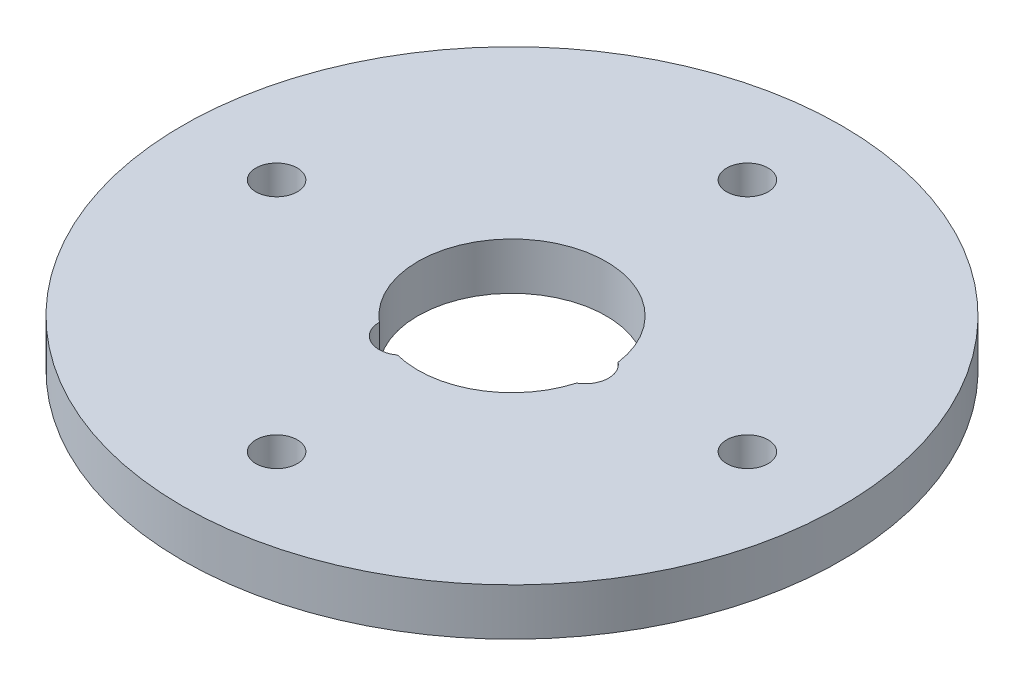
ISO-10303-21;
HEADER;
FILE_DESCRIPTION(('STEP AP214'),'2;1');
FILE_NAME('part.step','',(''),(''),'','','');
FILE_SCHEMA(('AUTOMOTIVE_DESIGN { 1 0 10303 214 1 1 1 1 }'));
ENDSEC;
DATA;
#1=APPLICATION_CONTEXT('core data for automotive mechanical design processes');
#2=APPLICATION_PROTOCOL_DEFINITION('international standard','automotive_design',2000,#1);
#3=PRODUCT_CONTEXT('',#1,'mechanical');
#4=PRODUCT('Part','Part','',(#3));
#5=PRODUCT_RELATED_PRODUCT_CATEGORY('part','',(#4));
#6=PRODUCT_DEFINITION_FORMATION('','',#4);
#7=PRODUCT_DEFINITION_CONTEXT('part definition',#1,'design');
#8=PRODUCT_DEFINITION('design','',#6,#7);
#9=PRODUCT_DEFINITION_SHAPE('','',#8);
#10=(LENGTH_UNIT() NAMED_UNIT(*) SI_UNIT(.MILLI.,.METRE.));
#11=(NAMED_UNIT(*) PLANE_ANGLE_UNIT() SI_UNIT($,.RADIAN.));
#12=(NAMED_UNIT(*) SI_UNIT($,.STERADIAN.) SOLID_ANGLE_UNIT());
#13=UNCERTAINTY_MEASURE_WITH_UNIT(LENGTH_MEASURE(1.E-05),#10,'distance_accuracy_value','');
#14=(GEOMETRIC_REPRESENTATION_CONTEXT(3) GLOBAL_UNCERTAINTY_ASSIGNED_CONTEXT((#13)) GLOBAL_UNIT_ASSIGNED_CONTEXT((#10,
#11,#12)) REPRESENTATION_CONTEXT('',''));
#15=CARTESIAN_POINT('',(0.,0.,0.));
#16=DIRECTION('',(0.,0.,1.));
#17=DIRECTION('',(1.,0.,0.));
#18=AXIS2_PLACEMENT_3D('',#15,#16,#17);
#19=CARTESIAN_POINT('',(-0.00401304574881721,3.75,-0.0154207823324574));
#20=DIRECTION('',(0.,-1.,0.));
#21=DIRECTION('',(0.,0.,-1.));
#22=AXIS2_PLACEMENT_3D('',#19,#20,#21);
#23=CYLINDRICAL_SURFACE('',#22,5.);
#24=DIRECTION('',(0.,-1.,0.));
#25=VECTOR('',#24,1.);
#26=CARTESIAN_POINT('',(4.80169126875611,2.5,1.36487123081139));
#27=LINE('',#26,#25);
#28=CARTESIAN_POINT('',(4.80169126875611,1.25,1.36487123081139));
#29=VERTEX_POINT('',#28);
#30=CARTESIAN_POINT('',(4.80169126875611,3.75,1.36487123081139));
#31=VERTEX_POINT('',#30);
#32=EDGE_CURVE('E13',#29,#31,#27,.F.);
#33=ORIENTED_EDGE('',*,*,#32,.F.);
#34=CARTESIAN_POINT('',(-0.00401304574881721,1.25,-0.0154207823324574));
#35=DIRECTION('',(0.,1.,0.));
#36=DIRECTION('',(0.,0.,1.));
#37=AXIS2_PLACEMENT_3D('',#34,#35,#36);
#38=CIRCLE('',#37,5.);
#39=CARTESIAN_POINT('',(-1.24269956867758,1.25,4.82871543560306));
#40=VERTEX_POINT('',#39);
#41=EDGE_CURVE('E104',#40,#29,#38,.T.);
#42=ORIENTED_EDGE('',*,*,#41,.F.);
#43=DIRECTION('',(0.,-1.,0.));
#44=VECTOR('',#43,1.);
#45=CARTESIAN_POINT('',(-1.24269956867758,2.5,4.82871543560306));
#46=LINE('',#45,#44);
#47=CARTESIAN_POINT('',(-1.24269956867758,3.75,4.82871543560306));
#48=VERTEX_POINT('',#47);
#49=EDGE_CURVE('E86',#48,#40,#46,.T.);
#50=ORIENTED_EDGE('',*,*,#49,.F.);
#51=CARTESIAN_POINT('',(-0.00401304574881721,3.75,-0.0154207823324574));
#52=DIRECTION('',(0.,1.,0.));
#53=DIRECTION('',(0.,0.,1.));
#54=AXIS2_PLACEMENT_3D('',#51,#52,#53);
#55=CIRCLE('',#54,5.);
#56=EDGE_CURVE('E111',#48,#31,#55,.T.);
#57=ORIENTED_EDGE('',*,*,#56,.T.);
#58=EDGE_LOOP('',(#33,#42,#50,#57));
#59=FACE_BOUND('',#58,.T.);
#60=ADVANCED_FACE('F49',(#59),#23,.F.);
#61=CARTESIAN_POINT('',(-0.00401304574881721,3.75,-0.0154207823324574));
#62=DIRECTION('',(0.,1.,0.));
#63=DIRECTION('',(0.,0.,1.));
#64=AXIS2_PLACEMENT_3D('',#61,#62,#63);
#65=PLANE('',#64);
#66=CARTESIAN_POINT('',(4.1754713074596,3.75,0.283044738219441));
#67=DIRECTION('',(0.,-1.,0.));
#68=DIRECTION('',(0.,0.,-1.));
#69=AXIS2_PLACEMENT_3D('',#66,#67,#68);
#70=CIRCLE('',#69,1.25);
#71=CARTESIAN_POINT('',(4.94906355657299,3.75,-0.698818303203185));
#72=VERTEX_POINT('',#71);
#73=EDGE_CURVE('E71',#72,#31,#70,.T.);
#74=ORIENTED_EDGE('',*,*,#73,.T.);
#75=ORIENTED_EDGE('',*,*,#56,.F.);
#76=CARTESIAN_POINT('',(-1.97872015545924,3.75,3.81838197786073));
#77=DIRECTION('',(0.,-1.,0.));
#78=DIRECTION('',(0.,0.,-1.));
#79=AXIS2_PLACEMENT_3D('',#76,#77,#78);
#80=CIRCLE('',#79,1.25);
#81=CARTESIAN_POINT('',(-3.22865675847568,3.75,3.805792758674));
#82=VERTEX_POINT('',#81);
#83=EDGE_CURVE('E64',#48,#82,#80,.T.);
#84=ORIENTED_EDGE('',*,*,#83,.T.);
#85=EDGE_CURVE('E125',#72,#82,#55,.T.);
#86=ORIENTED_EDGE('',*,*,#85,.F.);
#87=EDGE_LOOP('',(#74,#75,#84,#86));
#88=FACE_BOUND('',#87,.T.);
#89=CARTESIAN_POINT('',(-0.00401304574810973,3.75,12.4845792176675));
#90=DIRECTION('',(0.,1.,0.));
#91=DIRECTION('',(0.,0.,1.));
#92=AXIS2_PLACEMENT_3D('',#89,#90,#91);
#93=CIRCLE('',#92,1.10000000000076);
#94=CARTESIAN_POINT('',(-0.00401304574810973,3.75,13.5845792176683));
#95=VERTEX_POINT('',#94);
#96=EDGE_CURVE('E150',#95,#95,#93,.T.);
#97=ORIENTED_EDGE('',*,*,#96,.F.);
#98=EDGE_LOOP('',(#97));
#99=FACE_BOUND('',#98,.T.);
#100=CARTESIAN_POINT('',(-0.00401304574881721,3.75,-0.0154207823324574));
#101=DIRECTION('',(0.,1.,0.));
#102=DIRECTION('',(0.,0.,1.));
#103=AXIS2_PLACEMENT_3D('',#100,#101,#102);
#104=CIRCLE('',#103,17.5);
#105=CARTESIAN_POINT('',(-0.00401304574881721,3.75,17.4845792176675));
#106=VERTEX_POINT('',#105);
#107=EDGE_CURVE('E96',#106,#106,#104,.T.);
#108=ORIENTED_EDGE('',*,*,#107,.T.);
#109=EDGE_LOOP('',(#108));
#110=FACE_BOUND('',#109,.T.);
#111=CARTESIAN_POINT('',(-0.00401304574881721,3.75,-12.5154207823325));
#112=DIRECTION('',(0.,1.,0.));
#113=DIRECTION('',(0.,0.,1.));
#114=AXIS2_PLACEMENT_3D('',#111,#112,#113);
#115=CIRCLE('',#114,1.1);
#116=CARTESIAN_POINT('',(-0.00401304574881721,3.75,-11.4154207823325));
#117=VERTEX_POINT('',#116);
#118=EDGE_CURVE('E118',#117,#117,#115,.T.);
#119=ORIENTED_EDGE('',*,*,#118,.F.);
#120=EDGE_LOOP('',(#119));
#121=FACE_BOUND('',#120,.T.);
#122=CARTESIAN_POINT('',(12.4959869542515,3.75,-0.0154207823328111));
#123=DIRECTION('',(0.,1.,0.));
#124=DIRECTION('',(0.,0.,1.));
#125=AXIS2_PLACEMENT_3D('',#122,#123,#124);
#126=CIRCLE('',#125,1.10000000000028);
#127=CARTESIAN_POINT('',(12.4959869542515,3.75,1.08457921766747));
#128=VERTEX_POINT('',#127);
#129=EDGE_CURVE('E109',#128,#128,#126,.T.);
#130=ORIENTED_EDGE('',*,*,#129,.F.);
#131=EDGE_LOOP('',(#130));
#132=FACE_BOUND('',#131,.T.);
#133=CARTESIAN_POINT('',(-12.5040130457485,3.75,-0.0154207823321021));
#134=DIRECTION('',(0.,1.,0.));
#135=DIRECTION('',(0.,0.,1.));
#136=AXIS2_PLACEMENT_3D('',#133,#134,#135);
#137=CIRCLE('',#136,1.10000000000057);
#138=CARTESIAN_POINT('',(-12.5040130457485,3.75,1.08457921766847));
#139=VERTEX_POINT('',#138);
#140=EDGE_CURVE('E143',#139,#139,#137,.T.);
#141=ORIENTED_EDGE('',*,*,#140,.F.);
#142=EDGE_LOOP('',(#141));
#143=FACE_BOUND('',#142,.T.);
#144=ADVANCED_FACE('F138',(#88,#99,#110,#121,#132,#143),#65,.T.);
#145=CARTESIAN_POINT('',(-0.00401304574881721,1.25,-0.0154207823324574));
#146=DIRECTION('',(0.,1.,0.));
#147=DIRECTION('',(0.,0.,1.));
#148=AXIS2_PLACEMENT_3D('',#145,#146,#147);
#149=PLANE('',#148);
#150=CARTESIAN_POINT('',(-0.00401304574881721,1.25,-0.0154207823324574));
#151=DIRECTION('',(0.,1.,0.));
#152=DIRECTION('',(0.,0.,1.));
#153=AXIS2_PLACEMENT_3D('',#150,#151,#152);
#154=CIRCLE('',#153,17.5);
#155=CARTESIAN_POINT('',(-0.00401304574881721,1.25,17.4845792176675));
#156=VERTEX_POINT('',#155);
#157=EDGE_CURVE('E121',#156,#156,#154,.T.);
#158=ORIENTED_EDGE('',*,*,#157,.F.);
#159=EDGE_LOOP('',(#158));
#160=FACE_BOUND('',#159,.T.);
#161=CARTESIAN_POINT('',(-0.00401304574881721,1.25,-12.5154207823325));
#162=DIRECTION('',(0.,1.,0.));
#163=DIRECTION('',(0.,0.,1.));
#164=AXIS2_PLACEMENT_3D('',#161,#162,#163);
#165=CIRCLE('',#164,1.1);
#166=CARTESIAN_POINT('',(-0.00401304574881721,1.25,-11.4154207823325));
#167=VERTEX_POINT('',#166);
#168=EDGE_CURVE('E122',#167,#167,#165,.T.);
#169=ORIENTED_EDGE('',*,*,#168,.T.);
#170=EDGE_LOOP('',(#169));
#171=FACE_BOUND('',#170,.T.);
#172=ORIENTED_EDGE('',*,*,#41,.T.);
#173=CARTESIAN_POINT('',(4.1754713074596,1.25,0.283044738219441));
#174=DIRECTION('',(0.,-1.,0.));
#175=DIRECTION('',(0.,0.,-1.));
#176=AXIS2_PLACEMENT_3D('',#173,#174,#175);
#177=CIRCLE('',#176,1.25);
#178=CARTESIAN_POINT('',(4.94906355657299,1.25,-0.698818303203185));
#179=VERTEX_POINT('',#178);
#180=EDGE_CURVE('E131',#179,#29,#177,.T.);
#181=ORIENTED_EDGE('',*,*,#180,.F.);
#182=CARTESIAN_POINT('',(-3.22865675847568,1.25,3.805792758674));
#183=VERTEX_POINT('',#182);
#184=EDGE_CURVE('E106',#179,#183,#38,.T.);
#185=ORIENTED_EDGE('',*,*,#184,.T.);
#186=CARTESIAN_POINT('',(-1.97872015545924,1.25,3.81838197786073));
#187=DIRECTION('',(0.,-1.,0.));
#188=DIRECTION('',(0.,0.,-1.));
#189=AXIS2_PLACEMENT_3D('',#186,#187,#188);
#190=CIRCLE('',#189,1.25);
#191=EDGE_CURVE('E89',#40,#183,#190,.T.);
#192=ORIENTED_EDGE('',*,*,#191,.F.);
#193=EDGE_LOOP('',(#172,#181,#185,#192));
#194=FACE_BOUND('',#193,.T.);
#195=CARTESIAN_POINT('',(12.4959869542515,1.25,-0.0154207823328111));
#196=DIRECTION('',(0.,1.,0.));
#197=DIRECTION('',(0.,0.,1.));
#198=AXIS2_PLACEMENT_3D('',#195,#196,#197);
#199=CIRCLE('',#198,1.10000000000028);
#200=CARTESIAN_POINT('',(12.4959869542515,1.25,1.08457921766747));
#201=VERTEX_POINT('',#200);
#202=EDGE_CURVE('E113',#201,#201,#199,.T.);
#203=ORIENTED_EDGE('',*,*,#202,.T.);
#204=EDGE_LOOP('',(#203));
#205=FACE_BOUND('',#204,.T.);
#206=CARTESIAN_POINT('',(-0.00401304574810973,1.25,12.4845792176675));
#207=DIRECTION('',(0.,1.,0.));
#208=DIRECTION('',(0.,0.,1.));
#209=AXIS2_PLACEMENT_3D('',#206,#207,#208);
#210=CIRCLE('',#209,1.10000000000076);
#211=CARTESIAN_POINT('',(-0.00401304574810973,1.25,13.5845792176683));
#212=VERTEX_POINT('',#211);
#213=EDGE_CURVE('E146',#212,#212,#210,.T.);
#214=ORIENTED_EDGE('',*,*,#213,.T.);
#215=EDGE_LOOP('',(#214));
#216=FACE_BOUND('',#215,.T.);
#217=CARTESIAN_POINT('',(-12.5040130457485,1.25,-0.0154207823321021));
#218=DIRECTION('',(0.,1.,0.));
#219=DIRECTION('',(0.,0.,1.));
#220=AXIS2_PLACEMENT_3D('',#217,#218,#219);
#221=CIRCLE('',#220,1.10000000000057);
#222=CARTESIAN_POINT('',(-12.5040130457485,1.25,1.08457921766847));
#223=VERTEX_POINT('',#222);
#224=EDGE_CURVE('E147',#223,#223,#221,.T.);
#225=ORIENTED_EDGE('',*,*,#224,.T.);
#226=EDGE_LOOP('',(#225));
#227=FACE_BOUND('',#226,.T.);
#228=ADVANCED_FACE('F101',(#160,#171,#194,#205,#216,#227),#149,.F.);
#229=CARTESIAN_POINT('',(-0.00401304574881721,3.75,-0.0154207823324574));
#230=DIRECTION('',(0.,-1.,0.));
#231=DIRECTION('',(0.,0.,-1.));
#232=AXIS2_PLACEMENT_3D('',#229,#230,#231);
#233=CYLINDRICAL_SURFACE('',#232,17.5);
#234=ORIENTED_EDGE('',*,*,#107,.F.);
#235=EDGE_LOOP('',(#234));
#236=FACE_BOUND('',#235,.T.);
#237=ORIENTED_EDGE('',*,*,#157,.T.);
#238=EDGE_LOOP('',(#237));
#239=FACE_BOUND('',#238,.T.);
#240=ADVANCED_FACE('F51',(#236,#239),#233,.T.);
#241=CARTESIAN_POINT('',(-0.00401304574881721,3.75,-12.5154207823325));
#242=DIRECTION('',(0.,-1.,0.));
#243=DIRECTION('',(0.,0.,-1.));
#244=AXIS2_PLACEMENT_3D('',#241,#242,#243);
#245=CYLINDRICAL_SURFACE('',#244,1.1);
#246=ORIENTED_EDGE('',*,*,#118,.T.);
#247=EDGE_LOOP('',(#246));
#248=FACE_BOUND('',#247,.T.);
#249=ORIENTED_EDGE('',*,*,#168,.F.);
#250=EDGE_LOOP('',(#249));
#251=FACE_BOUND('',#250,.T.);
#252=ADVANCED_FACE('F170',(#248,#251),#245,.F.);
#253=DIRECTION('',(0.,-1.,0.));
#254=VECTOR('',#253,1.);
#255=CARTESIAN_POINT('',(4.94906355657299,2.5,-0.698818303203186));
#256=LINE('',#255,#254);
#257=EDGE_CURVE('E57',#72,#179,#256,.T.);
#258=ORIENTED_EDGE('',*,*,#257,.F.);
#259=ORIENTED_EDGE('',*,*,#85,.T.);
#260=DIRECTION('',(0.,-1.,0.));
#261=VECTOR('',#260,1.);
#262=CARTESIAN_POINT('',(-3.22865675847568,2.5,3.805792758674));
#263=LINE('',#262,#261);
#264=EDGE_CURVE('E95',#183,#82,#263,.F.);
#265=ORIENTED_EDGE('',*,*,#264,.F.);
#266=ORIENTED_EDGE('',*,*,#184,.F.);
#267=EDGE_LOOP('',(#258,#259,#265,#266));
#268=FACE_BOUND('',#267,.T.);
#269=ADVANCED_FACE('F136',(#268),#23,.F.);
#270=CARTESIAN_POINT('',(12.4959869542515,3.75,-0.0154207823328111));
#271=DIRECTION('',(0.,-1.,0.));
#272=DIRECTION('',(0.,0.,-1.));
#273=AXIS2_PLACEMENT_3D('',#270,#271,#272);
#274=CYLINDRICAL_SURFACE('',#273,1.10000000000028);
#275=ORIENTED_EDGE('',*,*,#129,.T.);
#276=EDGE_LOOP('',(#275));
#277=FACE_BOUND('',#276,.T.);
#278=ORIENTED_EDGE('',*,*,#202,.F.);
#279=EDGE_LOOP('',(#278));
#280=FACE_BOUND('',#279,.T.);
#281=ADVANCED_FACE('F158',(#277,#280),#274,.F.);
#282=CARTESIAN_POINT('',(-0.00401304574810973,3.75,12.4845792176675));
#283=DIRECTION('',(0.,-1.,0.));
#284=DIRECTION('',(0.,0.,-1.));
#285=AXIS2_PLACEMENT_3D('',#282,#283,#284);
#286=CYLINDRICAL_SURFACE('',#285,1.10000000000076);
#287=ORIENTED_EDGE('',*,*,#96,.T.);
#288=EDGE_LOOP('',(#287));
#289=FACE_BOUND('',#288,.T.);
#290=ORIENTED_EDGE('',*,*,#213,.F.);
#291=EDGE_LOOP('',(#290));
#292=FACE_BOUND('',#291,.T.);
#293=ADVANCED_FACE('F160',(#289,#292),#286,.F.);
#294=CARTESIAN_POINT('',(-12.5040130457485,3.75,-0.0154207823321021));
#295=DIRECTION('',(0.,-1.,0.));
#296=DIRECTION('',(0.,0.,-1.));
#297=AXIS2_PLACEMENT_3D('',#294,#295,#296);
#298=CYLINDRICAL_SURFACE('',#297,1.10000000000057);
#299=ORIENTED_EDGE('',*,*,#140,.T.);
#300=EDGE_LOOP('',(#299));
#301=FACE_BOUND('',#300,.T.);
#302=ORIENTED_EDGE('',*,*,#224,.F.);
#303=EDGE_LOOP('',(#302));
#304=FACE_BOUND('',#303,.T.);
#305=ADVANCED_FACE('F167',(#301,#304),#298,.F.);
#306=CARTESIAN_POINT('',(-1.97872015545924,3.75,3.81838197786073));
#307=DIRECTION('',(0.,-1.,0.));
#308=DIRECTION('',(0.,0.,-1.));
#309=AXIS2_PLACEMENT_3D('',#306,#307,#308);
#310=CYLINDRICAL_SURFACE('',#309,1.25);
#311=ORIENTED_EDGE('',*,*,#264,.T.);
#312=ORIENTED_EDGE('',*,*,#83,.F.);
#313=ORIENTED_EDGE('',*,*,#49,.T.);
#314=ORIENTED_EDGE('',*,*,#191,.T.);
#315=EDGE_LOOP('',(#311,#312,#313,#314));
#316=FACE_BOUND('',#315,.T.);
#317=ADVANCED_FACE('F88',(#316),#310,.F.);
#318=CARTESIAN_POINT('',(4.1754713074596,3.75,0.283044738219441));
#319=DIRECTION('',(0.,-1.,0.));
#320=DIRECTION('',(0.,0.,-1.));
#321=AXIS2_PLACEMENT_3D('',#318,#319,#320);
#322=CYLINDRICAL_SURFACE('',#321,1.25);
#323=ORIENTED_EDGE('',*,*,#32,.T.);
#324=ORIENTED_EDGE('',*,*,#73,.F.);
#325=ORIENTED_EDGE('',*,*,#257,.T.);
#326=ORIENTED_EDGE('',*,*,#180,.T.);
#327=EDGE_LOOP('',(#323,#324,#325,#326));
#328=FACE_BOUND('',#327,.T.);
#329=ADVANCED_FACE('F130',(#328),#322,.F.);
#330=CLOSED_SHELL('',(#60,#144,#228,#240,#252,#269,#281,#293,#305,#317,#329));
#331=MANIFOLD_SOLID_BREP('B2',#330);
#332=ADVANCED_BREP_SHAPE_REPRESENTATION('',(#18,#331),#14);
#333=SHAPE_DEFINITION_REPRESENTATION(#9,#332);
ENDSEC;
END-ISO-10303-21;
